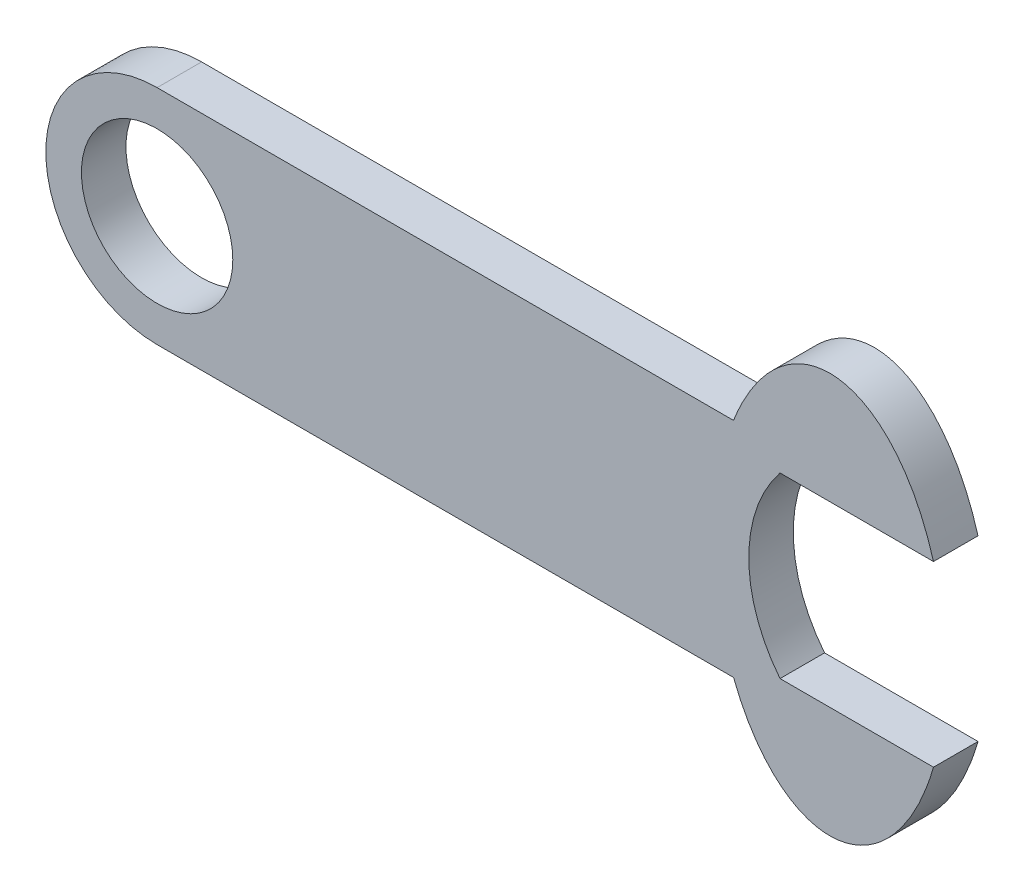
ISO-10303-21;
HEADER;
FILE_DESCRIPTION(('STEP AP214'),'2;1');
FILE_NAME('part.step','',(''),(''),'','','');
FILE_SCHEMA(('AUTOMOTIVE_DESIGN { 1 0 10303 214 1 1 1 1 }'));
ENDSEC;
DATA;
#1=APPLICATION_CONTEXT('core data for automotive mechanical design processes');
#2=APPLICATION_PROTOCOL_DEFINITION('international standard','automotive_design',2000,#1);
#3=PRODUCT_CONTEXT('',#1,'mechanical');
#4=PRODUCT('Part','Part','',(#3));
#5=PRODUCT_RELATED_PRODUCT_CATEGORY('part','',(#4));
#6=PRODUCT_DEFINITION_FORMATION('','',#4);
#7=PRODUCT_DEFINITION_CONTEXT('part definition',#1,'design');
#8=PRODUCT_DEFINITION('design','',#6,#7);
#9=PRODUCT_DEFINITION_SHAPE('','',#8);
#10=(LENGTH_UNIT() NAMED_UNIT(*) SI_UNIT(.MILLI.,.METRE.));
#11=(NAMED_UNIT(*) PLANE_ANGLE_UNIT() SI_UNIT($,.RADIAN.));
#12=(NAMED_UNIT(*) SI_UNIT($,.STERADIAN.) SOLID_ANGLE_UNIT());
#13=UNCERTAINTY_MEASURE_WITH_UNIT(LENGTH_MEASURE(1.E-05),#10,'distance_accuracy_value','');
#14=(GEOMETRIC_REPRESENTATION_CONTEXT(3) GLOBAL_UNCERTAINTY_ASSIGNED_CONTEXT((#13)) GLOBAL_UNIT_ASSIGNED_CONTEXT((#10,
#11,#12)) REPRESENTATION_CONTEXT('',''));
#15=CARTESIAN_POINT('',(0.,0.,0.));
#16=DIRECTION('',(0.,0.,1.));
#17=DIRECTION('',(1.,0.,0.));
#18=AXIS2_PLACEMENT_3D('',#15,#16,#17);
#19=CARTESIAN_POINT('',(0.,-20.,10.));
#20=DIRECTION('',(0.,1.,0.));
#21=DIRECTION('',(0.,0.,1.));
#22=AXIS2_PLACEMENT_3D('',#19,#20,#21);
#23=PLANE('',#22);
#24=DIRECTION('',(1.,0.,0.));
#25=VECTOR('',#24,1.);
#26=CARTESIAN_POINT('',(0.,-20.,0.));
#27=LINE('',#26,#25);
#28=CARTESIAN_POINT('',(89.3816215434433,-20.,0.));
#29=VERTEX_POINT('',#28);
#30=CARTESIAN_POINT('',(123.852580365455,-20.,0.));
#31=VERTEX_POINT('',#30);
#32=EDGE_CURVE('E190',#29,#31,#27,.T.);
#33=ORIENTED_EDGE('',*,*,#32,.F.);
#34=DIRECTION('',(0.,0.,-1.));
#35=VECTOR('',#34,1.);
#36=CARTESIAN_POINT('',(89.3816215434433,-20.,10.));
#37=LINE('',#36,#35);
#38=CARTESIAN_POINT('',(89.3816215434433,-20.,10.));
#39=VERTEX_POINT('',#38);
#40=EDGE_CURVE('E11',#39,#29,#37,.T.);
#41=ORIENTED_EDGE('',*,*,#40,.F.);
#42=DIRECTION('',(1.,0.,0.));
#43=VECTOR('',#42,1.);
#44=CARTESIAN_POINT('',(0.,-20.,10.));
#45=LINE('',#44,#43);
#46=CARTESIAN_POINT('',(123.852580365455,-20.,10.));
#47=VERTEX_POINT('',#46);
#48=EDGE_CURVE('E202',#39,#47,#45,.T.);
#49=ORIENTED_EDGE('',*,*,#48,.T.);
#50=DIRECTION('',(0.,0.,-1.));
#51=VECTOR('',#50,1.);
#52=CARTESIAN_POINT('',(123.852580365455,-20.,10.));
#53=LINE('',#52,#51);
#54=EDGE_CURVE('E88',#47,#31,#53,.T.);
#55=ORIENTED_EDGE('',*,*,#54,.T.);
#56=EDGE_LOOP('',(#33,#41,#49,#55));
#57=FACE_BOUND('',#56,.T.);
#58=ADVANCED_FACE('F37',(#57),#23,.T.);
#59=CARTESIAN_POINT('',(114.361613537037,0.,10.));
#60=DIRECTION('',(0.,0.,-1.));
#61=DIRECTION('',(-1.,0.,0.));
#62=AXIS2_PLACEMENT_3D('',#59,#60,#61);
#63=CYLINDRICAL_SURFACE('',#62,32.);
#64=CARTESIAN_POINT('',(114.361613537037,0.,0.));
#65=DIRECTION('',(0.,0.,1.));
#66=DIRECTION('',(1.,0.,0.));
#67=AXIS2_PLACEMENT_3D('',#64,#65,#66);
#68=CIRCLE('',#67,32.);
#69=CARTESIAN_POINT('',(89.3816215434433,20.,0.));
#70=VERTEX_POINT('',#69);
#71=EDGE_CURVE('E186',#70,#29,#68,.T.);
#72=ORIENTED_EDGE('',*,*,#71,.F.);
#73=DIRECTION('',(0.,0.,-1.));
#74=VECTOR('',#73,1.);
#75=CARTESIAN_POINT('',(89.3816215434433,20.,10.));
#76=LINE('',#75,#74);
#77=CARTESIAN_POINT('',(89.3816215434433,20.,10.));
#78=VERTEX_POINT('',#77);
#79=EDGE_CURVE('E45',#78,#70,#76,.T.);
#80=ORIENTED_EDGE('',*,*,#79,.F.);
#81=CARTESIAN_POINT('',(114.361613537037,0.,10.));
#82=DIRECTION('',(0.,0.,1.));
#83=DIRECTION('',(1.,0.,0.));
#84=AXIS2_PLACEMENT_3D('',#81,#82,#83);
#85=CIRCLE('',#84,32.);
#86=EDGE_CURVE('E282',#78,#39,#85,.T.);
#87=ORIENTED_EDGE('',*,*,#86,.T.);
#88=ORIENTED_EDGE('',*,*,#40,.T.);
#89=EDGE_LOOP('',(#72,#80,#87,#88));
#90=FACE_BOUND('',#89,.T.);
#91=ADVANCED_FACE('F189',(#90),#63,.F.);
#92=CARTESIAN_POINT('',(0.,20.,10.));
#93=DIRECTION('',(0.,1.,0.));
#94=DIRECTION('',(0.,0.,1.));
#95=AXIS2_PLACEMENT_3D('',#92,#93,#94);
#96=PLANE('',#95);
#97=DIRECTION('',(1.,0.,0.));
#98=VECTOR('',#97,1.);
#99=CARTESIAN_POINT('',(0.,20.,0.));
#100=LINE('',#99,#98);
#101=CARTESIAN_POINT('',(123.852580365455,20.,0.));
#102=VERTEX_POINT('',#101);
#103=EDGE_CURVE('E175',#70,#102,#100,.T.);
#104=ORIENTED_EDGE('',*,*,#103,.T.);
#105=DIRECTION('',(0.,0.,-1.));
#106=VECTOR('',#105,1.);
#107=CARTESIAN_POINT('',(123.852580365455,20.,10.));
#108=LINE('',#107,#106);
#109=CARTESIAN_POINT('',(123.852580365455,20.,10.));
#110=VERTEX_POINT('',#109);
#111=EDGE_CURVE('E166',#110,#102,#108,.T.);
#112=ORIENTED_EDGE('',*,*,#111,.F.);
#113=DIRECTION('',(1.,0.,0.));
#114=VECTOR('',#113,1.);
#115=CARTESIAN_POINT('',(0.,20.,10.));
#116=LINE('',#115,#114);
#117=EDGE_CURVE('E157',#78,#110,#116,.T.);
#118=ORIENTED_EDGE('',*,*,#117,.F.);
#119=ORIENTED_EDGE('',*,*,#79,.T.);
#120=EDGE_LOOP('',(#104,#112,#118,#119));
#121=FACE_BOUND('',#120,.T.);
#122=ADVANCED_FACE('F152',(#121),#96,.F.);
#123=CARTESIAN_POINT('',(100.561613537037,0.,10.));
#124=DIRECTION('',(0.,0.,1.));
#125=DIRECTION('',(0.,1.,0.));
#126=AXIS2_PLACEMENT_3D('',#123,#124,#125);
#127=ELLIPSE('',#126,45.,26.);
#128=DIRECTION('',(0.,0.,-1.));
#129=VECTOR('',#128,1.);
#130=SURFACE_OF_LINEAR_EXTRUSION('',#127,#129);
#131=CARTESIAN_POINT('',(100.561613537037,0.,0.));
#132=DIRECTION('',(0.,0.,1.));
#133=DIRECTION('',(0.,1.,0.));
#134=AXIS2_PLACEMENT_3D('',#131,#132,#133);
#135=ELLIPSE('',#134,45.,26.);
#136=CARTESIAN_POINT('',(78.9431486356764,25.,0.));
#137=VERTEX_POINT('',#136);
#138=EDGE_CURVE('E187',#102,#137,#135,.T.);
#139=ORIENTED_EDGE('',*,*,#138,.T.);
#140=DIRECTION('',(0.,0.,-1.));
#141=VECTOR('',#140,1.);
#142=CARTESIAN_POINT('',(78.9431486356764,25.,10.));
#143=LINE('',#142,#141);
#144=CARTESIAN_POINT('',(78.9431486356764,25.,10.));
#145=VERTEX_POINT('',#144);
#146=EDGE_CURVE('E161',#145,#137,#143,.T.);
#147=ORIENTED_EDGE('',*,*,#146,.F.);
#148=EDGE_CURVE('E154',#110,#145,#127,.T.);
#149=ORIENTED_EDGE('',*,*,#148,.F.);
#150=ORIENTED_EDGE('',*,*,#111,.T.);
#151=EDGE_LOOP('',(#139,#147,#149,#150));
#152=FACE_BOUND('',#151,.T.);
#153=ADVANCED_FACE('F147',(#152),#130,.F.);
#154=CARTESIAN_POINT('',(0.,25.,10.));
#155=DIRECTION('',(0.,1.,0.));
#156=DIRECTION('',(0.,0.,1.));
#157=AXIS2_PLACEMENT_3D('',#154,#155,#156);
#158=PLANE('',#157);
#159=DIRECTION('',(1.,0.,0.));
#160=VECTOR('',#159,1.);
#161=CARTESIAN_POINT('',(0.,25.,0.));
#162=LINE('',#161,#160);
#163=CARTESIAN_POINT('',(-50.5383864629631,25.,0.));
#164=VERTEX_POINT('',#163);
#165=EDGE_CURVE('E164',#164,#137,#162,.T.);
#166=ORIENTED_EDGE('',*,*,#165,.F.);
#167=DIRECTION('',(0.,0.,-1.));
#168=VECTOR('',#167,1.);
#169=CARTESIAN_POINT('',(-50.5383864629631,25.,10.));
#170=LINE('',#169,#168);
#171=CARTESIAN_POINT('',(-50.5383864629631,25.,10.));
#172=VERTEX_POINT('',#171);
#173=EDGE_CURVE('E121',#172,#164,#170,.T.);
#174=ORIENTED_EDGE('',*,*,#173,.F.);
#175=DIRECTION('',(1.,0.,0.));
#176=VECTOR('',#175,1.);
#177=CARTESIAN_POINT('',(0.,25.,10.));
#178=LINE('',#177,#176);
#179=EDGE_CURVE('E114',#172,#145,#178,.T.);
#180=ORIENTED_EDGE('',*,*,#179,.T.);
#181=ORIENTED_EDGE('',*,*,#146,.T.);
#182=EDGE_LOOP('',(#166,#174,#180,#181));
#183=FACE_BOUND('',#182,.T.);
#184=ADVANCED_FACE('F144',(#183),#158,.T.);
#185=CARTESIAN_POINT('',(-50.5383864629631,0.,10.));
#186=DIRECTION('',(0.,0.,-1.));
#187=DIRECTION('',(-1.,0.,0.));
#188=AXIS2_PLACEMENT_3D('',#185,#186,#187);
#189=CYLINDRICAL_SURFACE('',#188,25.);
#190=CARTESIAN_POINT('',(-50.5383864629631,0.,0.));
#191=DIRECTION('',(0.,0.,1.));
#192=DIRECTION('',(1.,0.,0.));
#193=AXIS2_PLACEMENT_3D('',#190,#191,#192);
#194=CIRCLE('',#193,25.);
#195=CARTESIAN_POINT('',(-50.5383864629631,-25.,0.));
#196=VERTEX_POINT('',#195);
#197=EDGE_CURVE('E120',#164,#196,#194,.T.);
#198=ORIENTED_EDGE('',*,*,#197,.T.);
#199=DIRECTION('',(0.,0.,-1.));
#200=VECTOR('',#199,1.);
#201=CARTESIAN_POINT('',(-50.5383864629631,-25.,10.));
#202=LINE('',#201,#200);
#203=CARTESIAN_POINT('',(-50.5383864629631,-25.,10.));
#204=VERTEX_POINT('',#203);
#205=EDGE_CURVE('E117',#204,#196,#202,.T.);
#206=ORIENTED_EDGE('',*,*,#205,.F.);
#207=CARTESIAN_POINT('',(-50.5383864629631,0.,10.));
#208=DIRECTION('',(0.,0.,1.));
#209=DIRECTION('',(1.,0.,0.));
#210=AXIS2_PLACEMENT_3D('',#207,#208,#209);
#211=CIRCLE('',#210,25.);
#212=EDGE_CURVE('E107',#172,#204,#211,.T.);
#213=ORIENTED_EDGE('',*,*,#212,.F.);
#214=ORIENTED_EDGE('',*,*,#173,.T.);
#215=EDGE_LOOP('',(#198,#206,#213,#214));
#216=FACE_BOUND('',#215,.T.);
#217=ADVANCED_FACE('F118',(#216),#189,.T.);
#218=CARTESIAN_POINT('',(0.,-25.,10.));
#219=DIRECTION('',(0.,1.,0.));
#220=DIRECTION('',(0.,0.,1.));
#221=AXIS2_PLACEMENT_3D('',#218,#219,#220);
#222=PLANE('',#221);
#223=DIRECTION('',(1.,0.,0.));
#224=VECTOR('',#223,1.);
#225=CARTESIAN_POINT('',(0.,-25.,0.));
#226=LINE('',#225,#224);
#227=CARTESIAN_POINT('',(78.9431486356764,-25.,0.));
#228=VERTEX_POINT('',#227);
#229=EDGE_CURVE('E81',#196,#228,#226,.T.);
#230=ORIENTED_EDGE('',*,*,#229,.T.);
#231=DIRECTION('',(0.,0.,-1.));
#232=VECTOR('',#231,1.);
#233=CARTESIAN_POINT('',(78.9431486356764,-25.,10.));
#234=LINE('',#233,#232);
#235=CARTESIAN_POINT('',(78.9431486356764,-25.,10.));
#236=VERTEX_POINT('',#235);
#237=EDGE_CURVE('E122',#236,#228,#234,.T.);
#238=ORIENTED_EDGE('',*,*,#237,.F.);
#239=DIRECTION('',(1.,0.,0.));
#240=VECTOR('',#239,1.);
#241=CARTESIAN_POINT('',(0.,-25.,10.));
#242=LINE('',#241,#240);
#243=EDGE_CURVE('E112',#204,#236,#242,.T.);
#244=ORIENTED_EDGE('',*,*,#243,.F.);
#245=ORIENTED_EDGE('',*,*,#205,.T.);
#246=EDGE_LOOP('',(#230,#238,#244,#245));
#247=FACE_BOUND('',#246,.T.);
#248=ADVANCED_FACE('F124',(#247),#222,.F.);
#249=CARTESIAN_POINT('',(100.561613537037,0.,10.));
#250=DIRECTION('',(0.,0.,1.));
#251=DIRECTION('',(0.,1.,0.));
#252=AXIS2_PLACEMENT_3D('',#249,#250,#251);
#253=ELLIPSE('',#252,45.,26.);
#254=DIRECTION('',(0.,0.,-1.));
#255=VECTOR('',#254,1.);
#256=SURFACE_OF_LINEAR_EXTRUSION('',#253,#255);
#257=CARTESIAN_POINT('',(100.561613537037,0.,0.));
#258=DIRECTION('',(0.,0.,1.));
#259=DIRECTION('',(0.,1.,0.));
#260=AXIS2_PLACEMENT_3D('',#257,#258,#259);
#261=ELLIPSE('',#260,45.,26.);
#262=EDGE_CURVE('E197',#228,#31,#261,.T.);
#263=ORIENTED_EDGE('',*,*,#262,.T.);
#264=ORIENTED_EDGE('',*,*,#54,.F.);
#265=EDGE_CURVE('E53',#236,#47,#253,.T.);
#266=ORIENTED_EDGE('',*,*,#265,.F.);
#267=ORIENTED_EDGE('',*,*,#237,.T.);
#268=EDGE_LOOP('',(#263,#264,#266,#267));
#269=FACE_BOUND('',#268,.T.);
#270=ADVANCED_FACE('F133',(#269),#256,.F.);
#271=CARTESIAN_POINT('',(-50.5383864629631,0.,10.));
#272=DIRECTION('',(0.,0.,-1.));
#273=DIRECTION('',(-1.,0.,0.));
#274=AXIS2_PLACEMENT_3D('',#271,#272,#273);
#275=CYLINDRICAL_SURFACE('',#274,17.);
#276=CARTESIAN_POINT('',(-50.5383864629631,0.,10.));
#277=DIRECTION('',(0.,0.,1.));
#278=DIRECTION('',(1.,0.,0.));
#279=AXIS2_PLACEMENT_3D('',#276,#277,#278);
#280=CIRCLE('',#279,17.);
#281=CARTESIAN_POINT('',(-33.5383864629631,0.,10.));
#282=VERTEX_POINT('',#281);
#283=EDGE_CURVE('E126',#282,#282,#280,.T.);
#284=ORIENTED_EDGE('',*,*,#283,.T.);
#285=EDGE_LOOP('',(#284));
#286=FACE_BOUND('',#285,.T.);
#287=CARTESIAN_POINT('',(-50.5383864629631,0.,0.));
#288=DIRECTION('',(0.,0.,1.));
#289=DIRECTION('',(1.,0.,0.));
#290=AXIS2_PLACEMENT_3D('',#287,#288,#289);
#291=CIRCLE('',#290,17.);
#292=CARTESIAN_POINT('',(-33.5383864629631,0.,0.));
#293=VERTEX_POINT('',#292);
#294=EDGE_CURVE('E199',#293,#293,#291,.T.);
#295=ORIENTED_EDGE('',*,*,#294,.F.);
#296=EDGE_LOOP('',(#295));
#297=FACE_BOUND('',#296,.T.);
#298=ADVANCED_FACE('F137',(#286,#297),#275,.F.);
#299=CARTESIAN_POINT('',(0.,0.,10.));
#300=DIRECTION('',(0.,0.,1.));
#301=DIRECTION('',(1.,0.,0.));
#302=AXIS2_PLACEMENT_3D('',#299,#300,#301);
#303=PLANE('',#302);
#304=ORIENTED_EDGE('',*,*,#48,.F.);
#305=ORIENTED_EDGE('',*,*,#86,.F.);
#306=ORIENTED_EDGE('',*,*,#117,.T.);
#307=ORIENTED_EDGE('',*,*,#148,.T.);
#308=ORIENTED_EDGE('',*,*,#179,.F.);
#309=ORIENTED_EDGE('',*,*,#212,.T.);
#310=ORIENTED_EDGE('',*,*,#243,.T.);
#311=ORIENTED_EDGE('',*,*,#265,.T.);
#312=EDGE_LOOP('',(#304,#305,#306,#307,#308,#309,#310,#311));
#313=FACE_BOUND('',#312,.T.);
#314=ORIENTED_EDGE('',*,*,#283,.F.);
#315=EDGE_LOOP('',(#314));
#316=FACE_BOUND('',#315,.T.);
#317=ADVANCED_FACE('F109',(#313,#316),#303,.T.);
#318=CARTESIAN_POINT('',(0.,0.,0.));
#319=DIRECTION('',(0.,0.,1.));
#320=DIRECTION('',(1.,0.,0.));
#321=AXIS2_PLACEMENT_3D('',#318,#319,#320);
#322=PLANE('',#321);
#323=ORIENTED_EDGE('',*,*,#32,.T.);
#324=ORIENTED_EDGE('',*,*,#262,.F.);
#325=ORIENTED_EDGE('',*,*,#229,.F.);
#326=ORIENTED_EDGE('',*,*,#197,.F.);
#327=ORIENTED_EDGE('',*,*,#165,.T.);
#328=ORIENTED_EDGE('',*,*,#138,.F.);
#329=ORIENTED_EDGE('',*,*,#103,.F.);
#330=ORIENTED_EDGE('',*,*,#71,.T.);
#331=EDGE_LOOP('',(#323,#324,#325,#326,#327,#328,#329,#330));
#332=FACE_BOUND('',#331,.T.);
#333=ORIENTED_EDGE('',*,*,#294,.T.);
#334=EDGE_LOOP('',(#333));
#335=FACE_BOUND('',#334,.T.);
#336=ADVANCED_FACE('F184',(#332,#335),#322,.F.);
#337=CLOSED_SHELL('',(#58,#91,#122,#153,#184,#217,#248,#270,#298,#317,#336));
#338=MANIFOLD_SOLID_BREP('B2',#337);
#339=ADVANCED_BREP_SHAPE_REPRESENTATION('',(#18,#338),#14);
#340=SHAPE_DEFINITION_REPRESENTATION(#9,#339);
ENDSEC;
END-ISO-10303-21;
